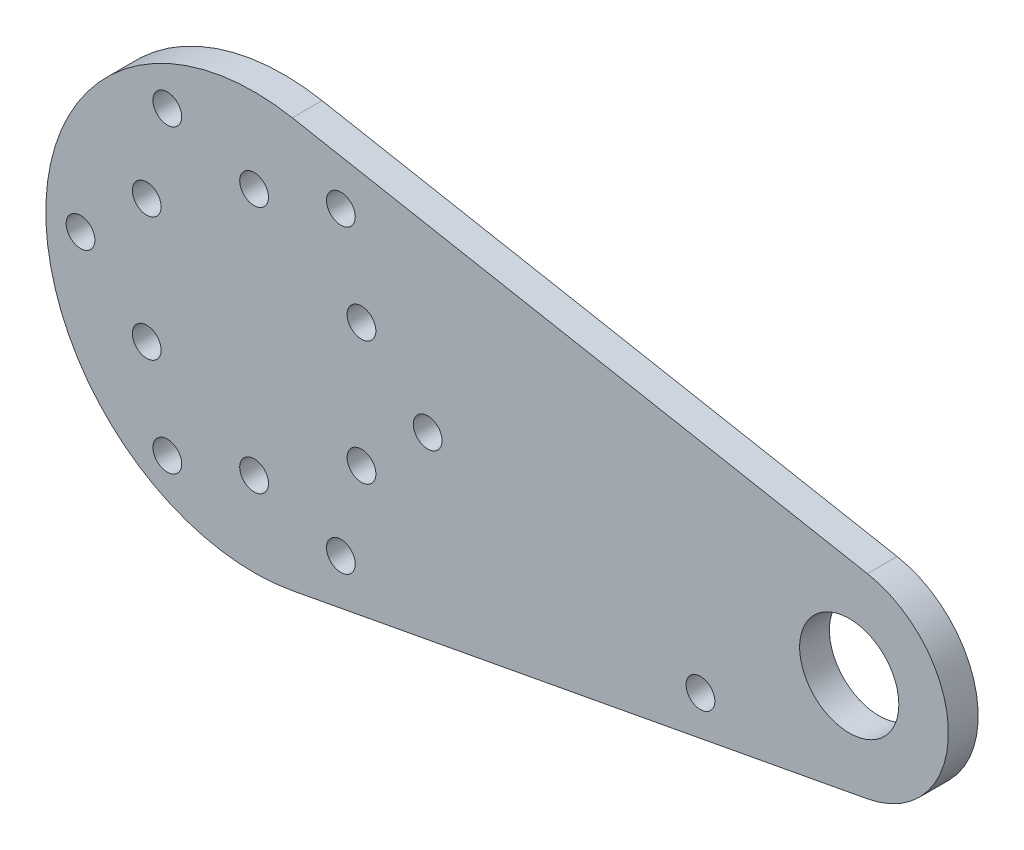
ISO-10303-21;
HEADER;
FILE_DESCRIPTION(('STEP AP214'),'2;1');
FILE_NAME('part.step','',(''),(''),'','','');
FILE_SCHEMA(('AUTOMOTIVE_DESIGN { 1 0 10303 214 1 1 1 1 }'));
ENDSEC;
DATA;
#1=APPLICATION_CONTEXT('core data for automotive mechanical design processes');
#2=APPLICATION_PROTOCOL_DEFINITION('international standard','automotive_design',2000,#1);
#3=PRODUCT_CONTEXT('',#1,'mechanical');
#4=PRODUCT('Part','Part','',(#3));
#5=PRODUCT_RELATED_PRODUCT_CATEGORY('part','',(#4));
#6=PRODUCT_DEFINITION_FORMATION('','',#4);
#7=PRODUCT_DEFINITION_CONTEXT('part definition',#1,'design');
#8=PRODUCT_DEFINITION('design','',#6,#7);
#9=PRODUCT_DEFINITION_SHAPE('','',#8);
#10=(LENGTH_UNIT() NAMED_UNIT(*) SI_UNIT(.MILLI.,.METRE.));
#11=(NAMED_UNIT(*) PLANE_ANGLE_UNIT() SI_UNIT($,.RADIAN.));
#12=(NAMED_UNIT(*) SI_UNIT($,.STERADIAN.) SOLID_ANGLE_UNIT());
#13=UNCERTAINTY_MEASURE_WITH_UNIT(LENGTH_MEASURE(1.E-05),#10,'distance_accuracy_value','');
#14=(GEOMETRIC_REPRESENTATION_CONTEXT(3) GLOBAL_UNCERTAINTY_ASSIGNED_CONTEXT((#13)) GLOBAL_UNIT_ASSIGNED_CONTEXT((#10,
#11,#12)) REPRESENTATION_CONTEXT('',''));
#15=CARTESIAN_POINT('',(0.,0.,0.));
#16=DIRECTION('',(0.,0.,1.));
#17=DIRECTION('',(1.,0.,0.));
#18=AXIS2_PLACEMENT_3D('',#15,#16,#17);
#19=CARTESIAN_POINT('',(60.,0.,3.));
#20=DIRECTION('',(0.,0.,1.));
#21=DIRECTION('',(1.,0.,0.));
#22=AXIS2_PLACEMENT_3D('',#19,#20,#21);
#23=PLANE('',#22);
#24=CARTESIAN_POINT('',(45.,-9.,3.));
#25=DIRECTION('',(0.,0.,1.));
#26=DIRECTION('',(1.,0.,0.));
#27=AXIS2_PLACEMENT_3D('',#24,#25,#26);
#28=CIRCLE('',#27,1.45);
#29=CARTESIAN_POINT('',(46.45,-9.,3.));
#30=VERTEX_POINT('',#29);
#31=EDGE_CURVE('E165',#30,#30,#28,.T.);
#32=ORIENTED_EDGE('',*,*,#31,.F.);
#33=EDGE_LOOP('',(#32));
#34=FACE_BOUND('',#33,.T.);
#35=CARTESIAN_POINT('',(17.5,0.,3.));
#36=DIRECTION('',(0.,0.,1.));
#37=DIRECTION('',(1.,0.,0.));
#38=AXIS2_PLACEMENT_3D('',#35,#36,#37);
#39=CIRCLE('',#38,1.45);
#40=CARTESIAN_POINT('',(18.95,0.,3.));
#41=VERTEX_POINT('',#40);
#42=EDGE_CURVE('E184',#41,#41,#39,.T.);
#43=ORIENTED_EDGE('',*,*,#42,.F.);
#44=EDGE_LOOP('',(#43));
#45=FACE_BOUND('',#44,.T.);
#46=CARTESIAN_POINT('',(8.74999999999993,-15.1554445662277,3.));
#47=DIRECTION('',(0.,0.,1.));
#48=DIRECTION('',(1.,0.,0.));
#49=AXIS2_PLACEMENT_3D('',#46,#47,#48);
#50=CIRCLE('',#49,1.45);
#51=CARTESIAN_POINT('',(10.1999999999999,-15.1554445662277,3.));
#52=VERTEX_POINT('',#51);
#53=EDGE_CURVE('E178',#52,#52,#50,.T.);
#54=ORIENTED_EDGE('',*,*,#53,.F.);
#55=EDGE_LOOP('',(#54));
#56=FACE_BOUND('',#55,.T.);
#57=CARTESIAN_POINT('',(-8.75000000000007,-15.1554445662276,3.));
#58=DIRECTION('',(0.,0.,1.));
#59=DIRECTION('',(1.,0.,0.));
#60=AXIS2_PLACEMENT_3D('',#57,#58,#59);
#61=CIRCLE('',#60,1.45);
#62=CARTESIAN_POINT('',(-7.30000000000007,-15.1554445662276,3.));
#63=VERTEX_POINT('',#62);
#64=EDGE_CURVE('E171',#63,#63,#61,.T.);
#65=ORIENTED_EDGE('',*,*,#64,.F.);
#66=EDGE_LOOP('',(#65));
#67=FACE_BOUND('',#66,.T.);
#68=CARTESIAN_POINT('',(-17.5,0.,3.));
#69=DIRECTION('',(0.,0.,1.));
#70=DIRECTION('',(1.,0.,0.));
#71=AXIS2_PLACEMENT_3D('',#68,#69,#70);
#72=CIRCLE('',#71,1.45);
#73=CARTESIAN_POINT('',(-16.05,0.,3.));
#74=VERTEX_POINT('',#73);
#75=EDGE_CURVE('E172',#74,#74,#72,.T.);
#76=ORIENTED_EDGE('',*,*,#75,.F.);
#77=EDGE_LOOP('',(#76));
#78=FACE_BOUND('',#77,.T.);
#79=CARTESIAN_POINT('',(-8.74999999999993,15.1554445662277,3.));
#80=DIRECTION('',(0.,0.,1.));
#81=DIRECTION('',(1.,0.,0.));
#82=AXIS2_PLACEMENT_3D('',#79,#80,#81);
#83=CIRCLE('',#82,1.45);
#84=CARTESIAN_POINT('',(-7.29999999999993,15.1554445662277,3.));
#85=VERTEX_POINT('',#84);
#86=EDGE_CURVE('E195',#85,#85,#83,.T.);
#87=ORIENTED_EDGE('',*,*,#86,.F.);
#88=EDGE_LOOP('',(#87));
#89=FACE_BOUND('',#88,.T.);
#90=CARTESIAN_POINT('',(8.75000000000007,15.1554445662276,3.));
#91=DIRECTION('',(0.,0.,1.));
#92=DIRECTION('',(1.,0.,0.));
#93=AXIS2_PLACEMENT_3D('',#90,#91,#92);
#94=CIRCLE('',#93,1.45);
#95=CARTESIAN_POINT('',(10.2000000000001,15.1554445662276,3.));
#96=VERTEX_POINT('',#95);
#97=EDGE_CURVE('E162',#96,#96,#94,.T.);
#98=ORIENTED_EDGE('',*,*,#97,.F.);
#99=EDGE_LOOP('',(#98));
#100=FACE_BOUND('',#99,.T.);
#101=CARTESIAN_POINT('',(-10.8253175473055,-6.2499999999999,3.));
#102=DIRECTION('',(0.,0.,1.));
#103=DIRECTION('',(1.,0.,0.));
#104=AXIS2_PLACEMENT_3D('',#101,#102,#103);
#105=CIRCLE('',#104,1.45);
#106=CARTESIAN_POINT('',(-9.37531754730555,-6.2499999999999,3.));
#107=VERTEX_POINT('',#106);
#108=EDGE_CURVE('E147',#107,#107,#105,.T.);
#109=ORIENTED_EDGE('',*,*,#108,.F.);
#110=EDGE_LOOP('',(#109));
#111=FACE_BOUND('',#110,.T.);
#112=CARTESIAN_POINT('',(10.8253175473055,-6.25000000000005,3.));
#113=DIRECTION('',(0.,0.,1.));
#114=DIRECTION('',(1.,0.,0.));
#115=AXIS2_PLACEMENT_3D('',#112,#113,#114);
#116=CIRCLE('',#115,1.45);
#117=CARTESIAN_POINT('',(12.2753175473055,-6.25000000000005,3.));
#118=VERTEX_POINT('',#117);
#119=EDGE_CURVE('E135',#118,#118,#116,.T.);
#120=ORIENTED_EDGE('',*,*,#119,.F.);
#121=EDGE_LOOP('',(#120));
#122=FACE_BOUND('',#121,.T.);
#123=CARTESIAN_POINT('',(0.,12.5,3.));
#124=DIRECTION('',(0.,0.,1.));
#125=DIRECTION('',(1.,0.,0.));
#126=AXIS2_PLACEMENT_3D('',#123,#124,#125);
#127=CIRCLE('',#126,1.45);
#128=CARTESIAN_POINT('',(1.45,12.5,3.));
#129=VERTEX_POINT('',#128);
#130=EDGE_CURVE('E123',#129,#129,#127,.T.);
#131=ORIENTED_EDGE('',*,*,#130,.F.);
#132=EDGE_LOOP('',(#131));
#133=FACE_BOUND('',#132,.T.);
#134=CARTESIAN_POINT('',(60.,0.,3.));
#135=DIRECTION('',(0.,0.,1.));
#136=DIRECTION('',(1.,0.,0.));
#137=AXIS2_PLACEMENT_3D('',#134,#135,#136);
#138=CIRCLE('',#137,10.);
#139=CARTESIAN_POINT('',(61.8333333333333,-9.83050806870575,3.));
#140=VERTEX_POINT('',#139);
#141=CARTESIAN_POINT('',(61.8333333333333,9.83050806870575,3.));
#142=VERTEX_POINT('',#141);
#143=EDGE_CURVE('E93',#140,#142,#138,.T.);
#144=ORIENTED_EDGE('',*,*,#143,.T.);
#145=DIRECTION('',(-0.983050806870575,0.183333333333333,0.));
#146=VECTOR('',#145,1.);
#147=CARTESIAN_POINT('',(3.85,20.6440669442821,3.));
#148=LINE('',#147,#146);
#149=CARTESIAN_POINT('',(3.85,20.6440669442821,3.));
#150=VERTEX_POINT('',#149);
#151=EDGE_CURVE('E88',#142,#150,#148,.T.);
#152=ORIENTED_EDGE('',*,*,#151,.T.);
#153=CARTESIAN_POINT('',(0.,0.,3.));
#154=DIRECTION('',(0.,0.,1.));
#155=DIRECTION('',(1.,0.,0.));
#156=AXIS2_PLACEMENT_3D('',#153,#154,#155);
#157=CIRCLE('',#156,21.);
#158=CARTESIAN_POINT('',(3.85,-20.6440669442821,3.));
#159=VERTEX_POINT('',#158);
#160=EDGE_CURVE('E91',#150,#159,#157,.T.);
#161=ORIENTED_EDGE('',*,*,#160,.T.);
#162=DIRECTION('',(0.983050806870575,0.183333333333333,0.));
#163=VECTOR('',#162,1.);
#164=CARTESIAN_POINT('',(61.8333333333333,-9.83050806870575,3.));
#165=LINE('',#164,#163);
#166=EDGE_CURVE('E58',#159,#140,#165,.T.);
#167=ORIENTED_EDGE('',*,*,#166,.T.);
#168=EDGE_LOOP('',(#144,#152,#161,#167));
#169=FACE_BOUND('',#168,.T.);
#170=CARTESIAN_POINT('',(60.,0.,3.));
#171=DIRECTION('',(0.,0.,1.));
#172=DIRECTION('',(1.,0.,0.));
#173=AXIS2_PLACEMENT_3D('',#170,#171,#172);
#174=CIRCLE('',#173,5.);
#175=CARTESIAN_POINT('',(65.,0.,3.));
#176=VERTEX_POINT('',#175);
#177=EDGE_CURVE('E108',#176,#176,#174,.T.);
#178=ORIENTED_EDGE('',*,*,#177,.F.);
#179=EDGE_LOOP('',(#178));
#180=FACE_BOUND('',#179,.T.);
#181=CARTESIAN_POINT('',(10.8253175473055,6.24999999999998,3.));
#182=DIRECTION('',(0.,0.,1.));
#183=DIRECTION('',(1.,0.,0.));
#184=AXIS2_PLACEMENT_3D('',#181,#182,#183);
#185=CIRCLE('',#184,1.45);
#186=CARTESIAN_POINT('',(12.2753175473055,6.24999999999998,3.));
#187=VERTEX_POINT('',#186);
#188=EDGE_CURVE('E129',#187,#187,#185,.T.);
#189=ORIENTED_EDGE('',*,*,#188,.F.);
#190=EDGE_LOOP('',(#189));
#191=FACE_BOUND('',#190,.T.);
#192=CARTESIAN_POINT('',(0.,-12.5,3.));
#193=DIRECTION('',(0.,0.,1.));
#194=DIRECTION('',(1.,0.,0.));
#195=AXIS2_PLACEMENT_3D('',#192,#193,#194);
#196=CIRCLE('',#195,1.45);
#197=CARTESIAN_POINT('',(1.44999999999991,-12.5,3.));
#198=VERTEX_POINT('',#197);
#199=EDGE_CURVE('E141',#198,#198,#196,.T.);
#200=ORIENTED_EDGE('',*,*,#199,.F.);
#201=EDGE_LOOP('',(#200));
#202=FACE_BOUND('',#201,.T.);
#203=CARTESIAN_POINT('',(-10.8253175473054,6.25000000000013,3.));
#204=DIRECTION('',(0.,0.,1.));
#205=DIRECTION('',(1.,0.,0.));
#206=AXIS2_PLACEMENT_3D('',#203,#204,#205);
#207=CIRCLE('',#206,1.45);
#208=CARTESIAN_POINT('',(-9.37531754730541,6.25000000000013,3.));
#209=VERTEX_POINT('',#208);
#210=EDGE_CURVE('E153',#209,#209,#207,.T.);
#211=ORIENTED_EDGE('',*,*,#210,.F.);
#212=EDGE_LOOP('',(#211));
#213=FACE_BOUND('',#212,.T.);
#214=ADVANCED_FACE('F41',(#34,#45,#56,#67,#78,#89,#100,#111,#122,#133,#169,#180,#191,#202,#213),
#23,.T.);
#215=CARTESIAN_POINT('',(60.,0.,0.));
#216=DIRECTION('',(0.,0.,1.));
#217=DIRECTION('',(1.,0.,0.));
#218=AXIS2_PLACEMENT_3D('',#215,#216,#217);
#219=PLANE('',#218);
#220=CARTESIAN_POINT('',(45.,-9.,0.));
#221=DIRECTION('',(0.,0.,1.));
#222=DIRECTION('',(1.,0.,0.));
#223=AXIS2_PLACEMENT_3D('',#220,#221,#222);
#224=CIRCLE('',#223,1.45);
#225=CARTESIAN_POINT('',(46.45,-9.,0.));
#226=VERTEX_POINT('',#225);
#227=EDGE_CURVE('E187',#226,#226,#224,.T.);
#228=ORIENTED_EDGE('',*,*,#227,.T.);
#229=EDGE_LOOP('',(#228));
#230=FACE_BOUND('',#229,.T.);
#231=CARTESIAN_POINT('',(17.5,0.,0.));
#232=DIRECTION('',(0.,0.,1.));
#233=DIRECTION('',(1.,0.,0.));
#234=AXIS2_PLACEMENT_3D('',#231,#232,#233);
#235=CIRCLE('',#234,1.45);
#236=CARTESIAN_POINT('',(18.95,0.,0.));
#237=VERTEX_POINT('',#236);
#238=EDGE_CURVE('E181',#237,#237,#235,.T.);
#239=ORIENTED_EDGE('',*,*,#238,.T.);
#240=EDGE_LOOP('',(#239));
#241=FACE_BOUND('',#240,.T.);
#242=CARTESIAN_POINT('',(8.74999999999993,-15.1554445662277,0.));
#243=DIRECTION('',(0.,0.,1.));
#244=DIRECTION('',(1.,0.,0.));
#245=AXIS2_PLACEMENT_3D('',#242,#243,#244);
#246=CIRCLE('',#245,1.45);
#247=CARTESIAN_POINT('',(10.1999999999999,-15.1554445662277,0.));
#248=VERTEX_POINT('',#247);
#249=EDGE_CURVE('E175',#248,#248,#246,.T.);
#250=ORIENTED_EDGE('',*,*,#249,.T.);
#251=EDGE_LOOP('',(#250));
#252=FACE_BOUND('',#251,.T.);
#253=CARTESIAN_POINT('',(-8.75000000000007,-15.1554445662276,0.));
#254=DIRECTION('',(0.,0.,1.));
#255=DIRECTION('',(1.,0.,0.));
#256=AXIS2_PLACEMENT_3D('',#253,#254,#255);
#257=CIRCLE('',#256,1.45);
#258=CARTESIAN_POINT('',(-7.30000000000007,-15.1554445662276,0.));
#259=VERTEX_POINT('',#258);
#260=EDGE_CURVE('E168',#259,#259,#257,.T.);
#261=ORIENTED_EDGE('',*,*,#260,.T.);
#262=EDGE_LOOP('',(#261));
#263=FACE_BOUND('',#262,.T.);
#264=CARTESIAN_POINT('',(-17.5,0.,0.));
#265=DIRECTION('',(0.,0.,1.));
#266=DIRECTION('',(1.,0.,0.));
#267=AXIS2_PLACEMENT_3D('',#264,#265,#266);
#268=CIRCLE('',#267,1.45);
#269=CARTESIAN_POINT('',(-16.05,0.,0.));
#270=VERTEX_POINT('',#269);
#271=EDGE_CURVE('E198',#270,#270,#268,.T.);
#272=ORIENTED_EDGE('',*,*,#271,.T.);
#273=EDGE_LOOP('',(#272));
#274=FACE_BOUND('',#273,.T.);
#275=CARTESIAN_POINT('',(-8.74999999999993,15.1554445662277,0.));
#276=DIRECTION('',(0.,0.,1.));
#277=DIRECTION('',(1.,0.,0.));
#278=AXIS2_PLACEMENT_3D('',#275,#276,#277);
#279=CIRCLE('',#278,1.45);
#280=CARTESIAN_POINT('',(-7.29999999999993,15.1554445662277,0.));
#281=VERTEX_POINT('',#280);
#282=EDGE_CURVE('E192',#281,#281,#279,.T.);
#283=ORIENTED_EDGE('',*,*,#282,.T.);
#284=EDGE_LOOP('',(#283));
#285=FACE_BOUND('',#284,.T.);
#286=CARTESIAN_POINT('',(8.75000000000007,15.1554445662276,0.));
#287=DIRECTION('',(0.,0.,1.));
#288=DIRECTION('',(1.,0.,0.));
#289=AXIS2_PLACEMENT_3D('',#286,#287,#288);
#290=CIRCLE('',#289,1.45);
#291=CARTESIAN_POINT('',(10.2000000000001,15.1554445662276,0.));
#292=VERTEX_POINT('',#291);
#293=EDGE_CURVE('E159',#292,#292,#290,.T.);
#294=ORIENTED_EDGE('',*,*,#293,.T.);
#295=EDGE_LOOP('',(#294));
#296=FACE_BOUND('',#295,.T.);
#297=CARTESIAN_POINT('',(60.,0.,0.));
#298=DIRECTION('',(0.,0.,1.));
#299=DIRECTION('',(1.,0.,0.));
#300=AXIS2_PLACEMENT_3D('',#297,#298,#299);
#301=CIRCLE('',#300,10.);
#302=CARTESIAN_POINT('',(61.8333333333333,-9.83050806870575,0.));
#303=VERTEX_POINT('',#302);
#304=CARTESIAN_POINT('',(61.8333333333333,9.83050806870575,0.));
#305=VERTEX_POINT('',#304);
#306=EDGE_CURVE('E105',#303,#305,#301,.T.);
#307=ORIENTED_EDGE('',*,*,#306,.F.);
#308=DIRECTION('',(0.983050806870575,0.183333333333333,0.));
#309=VECTOR('',#308,1.);
#310=CARTESIAN_POINT('',(61.8333333333333,-9.83050806870575,0.));
#311=LINE('',#310,#309);
#312=CARTESIAN_POINT('',(3.85,-20.6440669442821,0.));
#313=VERTEX_POINT('',#312);
#314=EDGE_CURVE('E81',#313,#303,#311,.T.);
#315=ORIENTED_EDGE('',*,*,#314,.F.);
#316=CARTESIAN_POINT('',(0.,0.,0.));
#317=DIRECTION('',(0.,0.,1.));
#318=DIRECTION('',(1.,0.,0.));
#319=AXIS2_PLACEMENT_3D('',#316,#317,#318);
#320=CIRCLE('',#319,21.);
#321=CARTESIAN_POINT('',(3.85,20.6440669442821,0.));
#322=VERTEX_POINT('',#321);
#323=EDGE_CURVE('E75',#322,#313,#320,.T.);
#324=ORIENTED_EDGE('',*,*,#323,.F.);
#325=DIRECTION('',(-0.983050806870575,0.183333333333333,0.));
#326=VECTOR('',#325,1.);
#327=CARTESIAN_POINT('',(3.85,20.6440669442821,0.));
#328=LINE('',#327,#326);
#329=EDGE_CURVE('E97',#305,#322,#328,.T.);
#330=ORIENTED_EDGE('',*,*,#329,.F.);
#331=EDGE_LOOP('',(#307,#315,#324,#330));
#332=FACE_BOUND('',#331,.T.);
#333=CARTESIAN_POINT('',(60.,0.,0.));
#334=DIRECTION('',(0.,0.,1.));
#335=DIRECTION('',(1.,0.,0.));
#336=AXIS2_PLACEMENT_3D('',#333,#334,#335);
#337=CIRCLE('',#336,5.);
#338=CARTESIAN_POINT('',(65.,0.,0.));
#339=VERTEX_POINT('',#338);
#340=EDGE_CURVE('E120',#339,#339,#337,.T.);
#341=ORIENTED_EDGE('',*,*,#340,.T.);
#342=EDGE_LOOP('',(#341));
#343=FACE_BOUND('',#342,.T.);
#344=CARTESIAN_POINT('',(0.,12.5,0.));
#345=DIRECTION('',(0.,0.,1.));
#346=DIRECTION('',(1.,0.,0.));
#347=AXIS2_PLACEMENT_3D('',#344,#345,#346);
#348=CIRCLE('',#347,1.45);
#349=CARTESIAN_POINT('',(1.45,12.5,0.));
#350=VERTEX_POINT('',#349);
#351=EDGE_CURVE('E126',#350,#350,#348,.T.);
#352=ORIENTED_EDGE('',*,*,#351,.T.);
#353=EDGE_LOOP('',(#352));
#354=FACE_BOUND('',#353,.T.);
#355=CARTESIAN_POINT('',(10.8253175473055,6.24999999999998,0.));
#356=DIRECTION('',(0.,0.,1.));
#357=DIRECTION('',(1.,0.,0.));
#358=AXIS2_PLACEMENT_3D('',#355,#356,#357);
#359=CIRCLE('',#358,1.45);
#360=CARTESIAN_POINT('',(12.2753175473055,6.24999999999998,0.));
#361=VERTEX_POINT('',#360);
#362=EDGE_CURVE('E132',#361,#361,#359,.T.);
#363=ORIENTED_EDGE('',*,*,#362,.T.);
#364=EDGE_LOOP('',(#363));
#365=FACE_BOUND('',#364,.T.);
#366=CARTESIAN_POINT('',(10.8253175473055,-6.25000000000005,0.));
#367=DIRECTION('',(0.,0.,1.));
#368=DIRECTION('',(1.,0.,0.));
#369=AXIS2_PLACEMENT_3D('',#366,#367,#368);
#370=CIRCLE('',#369,1.45);
#371=CARTESIAN_POINT('',(12.2753175473055,-6.25000000000005,0.));
#372=VERTEX_POINT('',#371);
#373=EDGE_CURVE('E138',#372,#372,#370,.T.);
#374=ORIENTED_EDGE('',*,*,#373,.T.);
#375=EDGE_LOOP('',(#374));
#376=FACE_BOUND('',#375,.T.);
#377=CARTESIAN_POINT('',(0.,-12.5,0.));
#378=DIRECTION('',(0.,0.,1.));
#379=DIRECTION('',(1.,0.,0.));
#380=AXIS2_PLACEMENT_3D('',#377,#378,#379);
#381=CIRCLE('',#380,1.45);
#382=CARTESIAN_POINT('',(1.44999999999991,-12.5,0.));
#383=VERTEX_POINT('',#382);
#384=EDGE_CURVE('E144',#383,#383,#381,.T.);
#385=ORIENTED_EDGE('',*,*,#384,.T.);
#386=EDGE_LOOP('',(#385));
#387=FACE_BOUND('',#386,.T.);
#388=CARTESIAN_POINT('',(-10.8253175473055,-6.2499999999999,0.));
#389=DIRECTION('',(0.,0.,1.));
#390=DIRECTION('',(1.,0.,0.));
#391=AXIS2_PLACEMENT_3D('',#388,#389,#390);
#392=CIRCLE('',#391,1.45);
#393=CARTESIAN_POINT('',(-9.37531754730555,-6.2499999999999,0.));
#394=VERTEX_POINT('',#393);
#395=EDGE_CURVE('E150',#394,#394,#392,.T.);
#396=ORIENTED_EDGE('',*,*,#395,.T.);
#397=EDGE_LOOP('',(#396));
#398=FACE_BOUND('',#397,.T.);
#399=CARTESIAN_POINT('',(-10.8253175473054,6.25000000000013,0.));
#400=DIRECTION('',(0.,0.,1.));
#401=DIRECTION('',(1.,0.,0.));
#402=AXIS2_PLACEMENT_3D('',#399,#400,#401);
#403=CIRCLE('',#402,1.45);
#404=CARTESIAN_POINT('',(-9.37531754730541,6.25000000000013,0.));
#405=VERTEX_POINT('',#404);
#406=EDGE_CURVE('E156',#405,#405,#403,.T.);
#407=ORIENTED_EDGE('',*,*,#406,.T.);
#408=EDGE_LOOP('',(#407));
#409=FACE_BOUND('',#408,.T.);
#410=ADVANCED_FACE('F116',(#230,#241,#252,#263,#274,#285,#296,#332,#343,#354,#365,#376,#387,
#398,#409),#219,.F.);
#411=CARTESIAN_POINT('',(60.,0.,3.));
#412=DIRECTION('',(0.,0.,-1.));
#413=DIRECTION('',(-1.,0.,0.));
#414=AXIS2_PLACEMENT_3D('',#411,#412,#413);
#415=CYLINDRICAL_SURFACE('',#414,10.);
#416=ORIENTED_EDGE('',*,*,#306,.T.);
#417=DIRECTION('',(0.,0.,-1.));
#418=VECTOR('',#417,1.);
#419=CARTESIAN_POINT('',(61.8333333333333,9.83050806870575,3.));
#420=LINE('',#419,#418);
#421=EDGE_CURVE('E11',#142,#305,#420,.T.);
#422=ORIENTED_EDGE('',*,*,#421,.F.);
#423=ORIENTED_EDGE('',*,*,#143,.F.);
#424=DIRECTION('',(0.,0.,-1.));
#425=VECTOR('',#424,1.);
#426=CARTESIAN_POINT('',(61.8333333333333,-9.83050806870575,3.));
#427=LINE('',#426,#425);
#428=EDGE_CURVE('E101',#140,#303,#427,.T.);
#429=ORIENTED_EDGE('',*,*,#428,.T.);
#430=EDGE_LOOP('',(#416,#422,#423,#429));
#431=FACE_BOUND('',#430,.T.);
#432=ADVANCED_FACE('F43',(#431),#415,.T.);
#433=CARTESIAN_POINT('',(3.85,20.6440669442821,3.));
#434=DIRECTION('',(-0.183333333333333,-0.983050806870575,0.));
#435=DIRECTION('',(0.983050806870575,-0.183333333333333,0.));
#436=AXIS2_PLACEMENT_3D('',#433,#434,#435);
#437=PLANE('',#436);
#438=ORIENTED_EDGE('',*,*,#329,.T.);
#439=DIRECTION('',(0.,0.,-1.));
#440=VECTOR('',#439,1.);
#441=CARTESIAN_POINT('',(3.85,20.6440669442821,3.));
#442=LINE('',#441,#440);
#443=EDGE_CURVE('E50',#150,#322,#442,.T.);
#444=ORIENTED_EDGE('',*,*,#443,.F.);
#445=ORIENTED_EDGE('',*,*,#151,.F.);
#446=ORIENTED_EDGE('',*,*,#421,.T.);
#447=EDGE_LOOP('',(#438,#444,#445,#446));
#448=FACE_BOUND('',#447,.T.);
#449=ADVANCED_FACE('F96',(#448),#437,.F.);
#450=CARTESIAN_POINT('',(0.,0.,3.));
#451=DIRECTION('',(0.,0.,-1.));
#452=DIRECTION('',(-1.,0.,0.));
#453=AXIS2_PLACEMENT_3D('',#450,#451,#452);
#454=CYLINDRICAL_SURFACE('',#453,21.);
#455=ORIENTED_EDGE('',*,*,#323,.T.);
#456=DIRECTION('',(0.,0.,-1.));
#457=VECTOR('',#456,1.);
#458=CARTESIAN_POINT('',(3.85,-20.6440669442821,3.));
#459=LINE('',#458,#457);
#460=EDGE_CURVE('E98',#159,#313,#459,.T.);
#461=ORIENTED_EDGE('',*,*,#460,.F.);
#462=ORIENTED_EDGE('',*,*,#160,.F.);
#463=ORIENTED_EDGE('',*,*,#443,.T.);
#464=EDGE_LOOP('',(#455,#461,#462,#463));
#465=FACE_BOUND('',#464,.T.);
#466=ADVANCED_FACE('F99',(#465),#454,.T.);
#467=CARTESIAN_POINT('',(61.8333333333333,-9.83050806870575,3.));
#468=DIRECTION('',(-0.183333333333333,0.983050806870575,0.));
#469=DIRECTION('',(-0.983050806870575,-0.183333333333333,0.));
#470=AXIS2_PLACEMENT_3D('',#467,#468,#469);
#471=PLANE('',#470);
#472=ORIENTED_EDGE('',*,*,#314,.T.);
#473=ORIENTED_EDGE('',*,*,#428,.F.);
#474=ORIENTED_EDGE('',*,*,#166,.F.);
#475=ORIENTED_EDGE('',*,*,#460,.T.);
#476=EDGE_LOOP('',(#472,#473,#474,#475));
#477=FACE_BOUND('',#476,.T.);
#478=ADVANCED_FACE('F113',(#477),#471,.F.);
#479=CARTESIAN_POINT('',(60.,0.,3.));
#480=DIRECTION('',(0.,0.,-1.));
#481=DIRECTION('',(-1.,0.,0.));
#482=AXIS2_PLACEMENT_3D('',#479,#480,#481);
#483=CYLINDRICAL_SURFACE('',#482,5.);
#484=ORIENTED_EDGE('',*,*,#177,.T.);
#485=EDGE_LOOP('',(#484));
#486=FACE_BOUND('',#485,.T.);
#487=ORIENTED_EDGE('',*,*,#340,.F.);
#488=EDGE_LOOP('',(#487));
#489=FACE_BOUND('',#488,.T.);
#490=ADVANCED_FACE('F224',(#486,#489),#483,.F.);
#491=CARTESIAN_POINT('',(0.,12.5,3.));
#492=DIRECTION('',(0.,0.,-1.));
#493=DIRECTION('',(-1.,0.,0.));
#494=AXIS2_PLACEMENT_3D('',#491,#492,#493);
#495=CYLINDRICAL_SURFACE('',#494,1.45);
#496=ORIENTED_EDGE('',*,*,#130,.T.);
#497=EDGE_LOOP('',(#496));
#498=FACE_BOUND('',#497,.T.);
#499=ORIENTED_EDGE('',*,*,#351,.F.);
#500=EDGE_LOOP('',(#499));
#501=FACE_BOUND('',#500,.T.);
#502=ADVANCED_FACE('F220',(#498,#501),#495,.F.);
#503=CARTESIAN_POINT('',(10.8253175473055,6.24999999999998,3.));
#504=DIRECTION('',(0.,0.,-1.));
#505=DIRECTION('',(-1.,0.,0.));
#506=AXIS2_PLACEMENT_3D('',#503,#504,#505);
#507=CYLINDRICAL_SURFACE('',#506,1.45);
#508=ORIENTED_EDGE('',*,*,#188,.T.);
#509=EDGE_LOOP('',(#508));
#510=FACE_BOUND('',#509,.T.);
#511=ORIENTED_EDGE('',*,*,#362,.F.);
#512=EDGE_LOOP('',(#511));
#513=FACE_BOUND('',#512,.T.);
#514=ADVANCED_FACE('F223',(#510,#513),#507,.F.);
#515=CARTESIAN_POINT('',(10.8253175473055,-6.25000000000005,3.));
#516=DIRECTION('',(0.,0.,-1.));
#517=DIRECTION('',(-1.,0.,0.));
#518=AXIS2_PLACEMENT_3D('',#515,#516,#517);
#519=CYLINDRICAL_SURFACE('',#518,1.45);
#520=ORIENTED_EDGE('',*,*,#119,.T.);
#521=EDGE_LOOP('',(#520));
#522=FACE_BOUND('',#521,.T.);
#523=ORIENTED_EDGE('',*,*,#373,.F.);
#524=EDGE_LOOP('',(#523));
#525=FACE_BOUND('',#524,.T.);
#526=ADVANCED_FACE('F262',(#522,#525),#519,.F.);
#527=CARTESIAN_POINT('',(0.,-12.5,3.));
#528=DIRECTION('',(0.,0.,-1.));
#529=DIRECTION('',(-1.,0.,0.));
#530=AXIS2_PLACEMENT_3D('',#527,#528,#529);
#531=CYLINDRICAL_SURFACE('',#530,1.45);
#532=ORIENTED_EDGE('',*,*,#199,.T.);
#533=EDGE_LOOP('',(#532));
#534=FACE_BOUND('',#533,.T.);
#535=ORIENTED_EDGE('',*,*,#384,.F.);
#536=EDGE_LOOP('',(#535));
#537=FACE_BOUND('',#536,.T.);
#538=ADVANCED_FACE('F255',(#534,#537),#531,.F.);
#539=CARTESIAN_POINT('',(-10.8253175473055,-6.2499999999999,3.));
#540=DIRECTION('',(0.,0.,-1.));
#541=DIRECTION('',(-1.,0.,0.));
#542=AXIS2_PLACEMENT_3D('',#539,#540,#541);
#543=CYLINDRICAL_SURFACE('',#542,1.45);
#544=ORIENTED_EDGE('',*,*,#108,.T.);
#545=EDGE_LOOP('',(#544));
#546=FACE_BOUND('',#545,.T.);
#547=ORIENTED_EDGE('',*,*,#395,.F.);
#548=EDGE_LOOP('',(#547));
#549=FACE_BOUND('',#548,.T.);
#550=ADVANCED_FACE('F245',(#546,#549),#543,.F.);
#551=CARTESIAN_POINT('',(-10.8253175473054,6.25000000000013,3.));
#552=DIRECTION('',(0.,0.,-1.));
#553=DIRECTION('',(-1.,0.,0.));
#554=AXIS2_PLACEMENT_3D('',#551,#552,#553);
#555=CYLINDRICAL_SURFACE('',#554,1.45);
#556=ORIENTED_EDGE('',*,*,#210,.T.);
#557=EDGE_LOOP('',(#556));
#558=FACE_BOUND('',#557,.T.);
#559=ORIENTED_EDGE('',*,*,#406,.F.);
#560=EDGE_LOOP('',(#559));
#561=FACE_BOUND('',#560,.T.);
#562=ADVANCED_FACE('F242',(#558,#561),#555,.F.);
#563=CARTESIAN_POINT('',(8.75000000000007,15.1554445662276,0.));
#564=DIRECTION('',(0.,0.,1.));
#565=DIRECTION('',(1.,0.,0.));
#566=AXIS2_PLACEMENT_3D('',#563,#564,#565);
#567=CYLINDRICAL_SURFACE('',#566,1.45);
#568=ORIENTED_EDGE('',*,*,#293,.F.);
#569=EDGE_LOOP('',(#568));
#570=FACE_BOUND('',#569,.T.);
#571=ORIENTED_EDGE('',*,*,#97,.T.);
#572=EDGE_LOOP('',(#571));
#573=FACE_BOUND('',#572,.T.);
#574=ADVANCED_FACE('F244',(#570,#573),#567,.F.);
#575=CARTESIAN_POINT('',(-8.74999999999993,15.1554445662277,0.));
#576=DIRECTION('',(0.,0.,1.));
#577=DIRECTION('',(1.,0.,0.));
#578=AXIS2_PLACEMENT_3D('',#575,#576,#577);
#579=CYLINDRICAL_SURFACE('',#578,1.45);
#580=ORIENTED_EDGE('',*,*,#282,.F.);
#581=EDGE_LOOP('',(#580));
#582=FACE_BOUND('',#581,.T.);
#583=ORIENTED_EDGE('',*,*,#86,.T.);
#584=EDGE_LOOP('',(#583));
#585=FACE_BOUND('',#584,.T.);
#586=ADVANCED_FACE('F252',(#582,#585),#579,.F.);
#587=CARTESIAN_POINT('',(-17.5,0.,0.));
#588=DIRECTION('',(0.,0.,1.));
#589=DIRECTION('',(1.,0.,0.));
#590=AXIS2_PLACEMENT_3D('',#587,#588,#589);
#591=CYLINDRICAL_SURFACE('',#590,1.45);
#592=ORIENTED_EDGE('',*,*,#271,.F.);
#593=EDGE_LOOP('',(#592));
#594=FACE_BOUND('',#593,.T.);
#595=ORIENTED_EDGE('',*,*,#75,.T.);
#596=EDGE_LOOP('',(#595));
#597=FACE_BOUND('',#596,.T.);
#598=ADVANCED_FACE('F204',(#594,#597),#591,.F.);
#599=CARTESIAN_POINT('',(-8.75000000000007,-15.1554445662276,0.));
#600=DIRECTION('',(0.,0.,1.));
#601=DIRECTION('',(1.,0.,0.));
#602=AXIS2_PLACEMENT_3D('',#599,#600,#601);
#603=CYLINDRICAL_SURFACE('',#602,1.45);
#604=ORIENTED_EDGE('',*,*,#260,.F.);
#605=EDGE_LOOP('',(#604));
#606=FACE_BOUND('',#605,.T.);
#607=ORIENTED_EDGE('',*,*,#64,.T.);
#608=EDGE_LOOP('',(#607));
#609=FACE_BOUND('',#608,.T.);
#610=ADVANCED_FACE('F368',(#606,#609),#603,.F.);
#611=CARTESIAN_POINT('',(8.74999999999993,-15.1554445662277,0.));
#612=DIRECTION('',(0.,0.,1.));
#613=DIRECTION('',(1.,0.,0.));
#614=AXIS2_PLACEMENT_3D('',#611,#612,#613);
#615=CYLINDRICAL_SURFACE('',#614,1.45);
#616=ORIENTED_EDGE('',*,*,#249,.F.);
#617=EDGE_LOOP('',(#616));
#618=FACE_BOUND('',#617,.T.);
#619=ORIENTED_EDGE('',*,*,#53,.T.);
#620=EDGE_LOOP('',(#619));
#621=FACE_BOUND('',#620,.T.);
#622=ADVANCED_FACE('F378',(#618,#621),#615,.F.);
#623=CARTESIAN_POINT('',(17.5,0.,0.));
#624=DIRECTION('',(0.,0.,1.));
#625=DIRECTION('',(1.,0.,0.));
#626=AXIS2_PLACEMENT_3D('',#623,#624,#625);
#627=CYLINDRICAL_SURFACE('',#626,1.45);
#628=ORIENTED_EDGE('',*,*,#238,.F.);
#629=EDGE_LOOP('',(#628));
#630=FACE_BOUND('',#629,.T.);
#631=ORIENTED_EDGE('',*,*,#42,.T.);
#632=EDGE_LOOP('',(#631));
#633=FACE_BOUND('',#632,.T.);
#634=ADVANCED_FACE('F387',(#630,#633),#627,.F.);
#635=CARTESIAN_POINT('',(45.,-9.,0.));
#636=DIRECTION('',(0.,0.,1.));
#637=DIRECTION('',(1.,0.,0.));
#638=AXIS2_PLACEMENT_3D('',#635,#636,#637);
#639=CYLINDRICAL_SURFACE('',#638,1.45);
#640=ORIENTED_EDGE('',*,*,#227,.F.);
#641=EDGE_LOOP('',(#640));
#642=FACE_BOUND('',#641,.T.);
#643=ORIENTED_EDGE('',*,*,#31,.T.);
#644=EDGE_LOOP('',(#643));
#645=FACE_BOUND('',#644,.T.);
#646=ADVANCED_FACE('F397',(#642,#645),#639,.F.);
#647=CLOSED_SHELL('',(#214,#410,#432,#449,#466,#478,#490,#502,#514,#526,#538,#550,#562,#574,
#586,#598,#610,#622,#634,#646));
#648=MANIFOLD_SOLID_BREP('B2',#647);
#649=ADVANCED_BREP_SHAPE_REPRESENTATION('',(#18,#648),#14);
#650=SHAPE_DEFINITION_REPRESENTATION(#9,#649);
ENDSEC;
END-ISO-10303-21;
